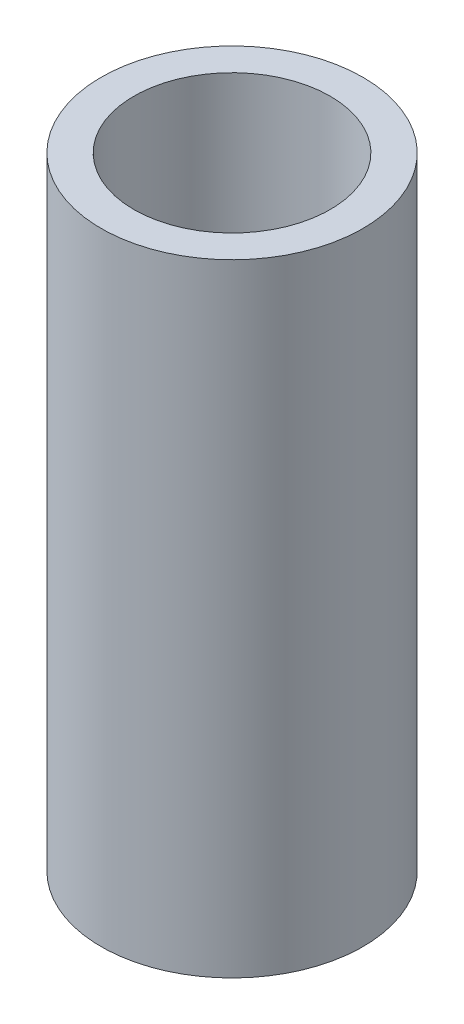
ISO-10303-21;
HEADER;
FILE_DESCRIPTION(('STEP AP214'),'2;1');
FILE_NAME('part.step','',(''),(''),'','','');
FILE_SCHEMA(('AUTOMOTIVE_DESIGN { 1 0 10303 214 1 1 1 1 }'));
ENDSEC;
DATA;
#1=APPLICATION_CONTEXT('core data for automotive mechanical design processes');
#2=APPLICATION_PROTOCOL_DEFINITION('international standard','automotive_design',2000,#1);
#3=PRODUCT_CONTEXT('',#1,'mechanical');
#4=PRODUCT('Part','Part','',(#3));
#5=PRODUCT_RELATED_PRODUCT_CATEGORY('part','',(#4));
#6=PRODUCT_DEFINITION_FORMATION('','',#4);
#7=PRODUCT_DEFINITION_CONTEXT('part definition',#1,'design');
#8=PRODUCT_DEFINITION('design','',#6,#7);
#9=PRODUCT_DEFINITION_SHAPE('','',#8);
#10=(LENGTH_UNIT() NAMED_UNIT(*) SI_UNIT(.MILLI.,.METRE.));
#11=(NAMED_UNIT(*) PLANE_ANGLE_UNIT() SI_UNIT($,.RADIAN.));
#12=(NAMED_UNIT(*) SI_UNIT($,.STERADIAN.) SOLID_ANGLE_UNIT());
#13=UNCERTAINTY_MEASURE_WITH_UNIT(LENGTH_MEASURE(1.E-05),#10,'distance_accuracy_value','');
#14=(GEOMETRIC_REPRESENTATION_CONTEXT(3) GLOBAL_UNCERTAINTY_ASSIGNED_CONTEXT((#13)) GLOBAL_UNIT_ASSIGNED_CONTEXT((#10,
#11,#12)) REPRESENTATION_CONTEXT('',''));
#15=CARTESIAN_POINT('',(0.,0.,0.));
#16=DIRECTION('',(0.,0.,1.));
#17=DIRECTION('',(1.,0.,0.));
#18=AXIS2_PLACEMENT_3D('',#15,#16,#17);
#19=CARTESIAN_POINT('',(0.,9.5,0.));
#20=DIRECTION('',(0.,1.,0.));
#21=DIRECTION('',(0.,0.,-1.));
#22=AXIS2_PLACEMENT_3D('',#19,#20,#21);
#23=PLANE('',#22);
#24=CARTESIAN_POINT('',(0.,9.5,0.));
#25=DIRECTION('',(0.,-1.,0.));
#26=DIRECTION('',(0.,0.,-1.));
#27=AXIS2_PLACEMENT_3D('',#24,#25,#26);
#28=CIRCLE('',#27,2.);
#29=CARTESIAN_POINT('',(0.,9.5,-2.));
#30=VERTEX_POINT('',#29);
#31=EDGE_CURVE('E10',#30,#30,#28,.T.);
#32=ORIENTED_EDGE('',*,*,#31,.F.);
#33=EDGE_LOOP('',(#32));
#34=FACE_BOUND('',#33,.T.);
#35=CARTESIAN_POINT('',(0.,9.5,0.));
#36=DIRECTION('',(0.,-1.,0.));
#37=DIRECTION('',(0.,0.,-1.));
#38=AXIS2_PLACEMENT_3D('',#35,#36,#37);
#39=CIRCLE('',#38,1.5);
#40=CARTESIAN_POINT('',(0.,9.5,-1.5));
#41=VERTEX_POINT('',#40);
#42=EDGE_CURVE('E41',#41,#41,#39,.T.);
#43=ORIENTED_EDGE('',*,*,#42,.T.);
#44=EDGE_LOOP('',(#43));
#45=FACE_BOUND('',#44,.T.);
#46=ADVANCED_FACE('F30',(#34,#45),#23,.T.);
#47=CARTESIAN_POINT('',(0.,0.,0.));
#48=DIRECTION('',(0.,1.,0.));
#49=DIRECTION('',(0.,0.,-1.));
#50=AXIS2_PLACEMENT_3D('',#47,#48,#49);
#51=PLANE('',#50);
#52=CARTESIAN_POINT('',(0.,0.,0.));
#53=DIRECTION('',(0.,-1.,0.));
#54=DIRECTION('',(0.,0.,-1.));
#55=AXIS2_PLACEMENT_3D('',#52,#53,#54);
#56=CIRCLE('',#55,2.);
#57=CARTESIAN_POINT('',(0.,0.,-2.));
#58=VERTEX_POINT('',#57);
#59=EDGE_CURVE('E34',#58,#58,#56,.T.);
#60=ORIENTED_EDGE('',*,*,#59,.T.);
#61=EDGE_LOOP('',(#60));
#62=FACE_BOUND('',#61,.T.);
#63=CARTESIAN_POINT('',(0.,0.,0.));
#64=DIRECTION('',(0.,-1.,0.));
#65=DIRECTION('',(0.,0.,-1.));
#66=AXIS2_PLACEMENT_3D('',#63,#64,#65);
#67=CIRCLE('',#66,1.5);
#68=CARTESIAN_POINT('',(0.,0.,-1.5));
#69=VERTEX_POINT('',#68);
#70=EDGE_CURVE('E43',#69,#69,#67,.T.);
#71=ORIENTED_EDGE('',*,*,#70,.F.);
#72=EDGE_LOOP('',(#71));
#73=FACE_BOUND('',#72,.T.);
#74=ADVANCED_FACE('F56',(#62,#73),#51,.F.);
#75=CARTESIAN_POINT('',(0.,9.5,0.));
#76=DIRECTION('',(0.,-1.,0.));
#77=DIRECTION('',(0.,0.,1.));
#78=AXIS2_PLACEMENT_3D('',#75,#76,#77);
#79=CYLINDRICAL_SURFACE('',#78,2.);
#80=ORIENTED_EDGE('',*,*,#31,.T.);
#81=EDGE_LOOP('',(#80));
#82=FACE_BOUND('',#81,.T.);
#83=ORIENTED_EDGE('',*,*,#59,.F.);
#84=EDGE_LOOP('',(#83));
#85=FACE_BOUND('',#84,.T.);
#86=ADVANCED_FACE('F32',(#82,#85),#79,.T.);
#87=CARTESIAN_POINT('',(0.,9.5,0.));
#88=DIRECTION('',(0.,-1.,0.));
#89=DIRECTION('',(0.,0.,1.));
#90=AXIS2_PLACEMENT_3D('',#87,#88,#89);
#91=CYLINDRICAL_SURFACE('',#90,1.5);
#92=ORIENTED_EDGE('',*,*,#42,.F.);
#93=EDGE_LOOP('',(#92));
#94=FACE_BOUND('',#93,.T.);
#95=ORIENTED_EDGE('',*,*,#70,.T.);
#96=EDGE_LOOP('',(#95));
#97=FACE_BOUND('',#96,.T.);
#98=ADVANCED_FACE('F50',(#94,#97),#91,.F.);
#99=CLOSED_SHELL('',(#46,#74,#86,#98));
#100=MANIFOLD_SOLID_BREP('B2',#99);
#101=ADVANCED_BREP_SHAPE_REPRESENTATION('',(#18,#100),#14);
#102=SHAPE_DEFINITION_REPRESENTATION(#9,#101);
ENDSEC;
END-ISO-10303-21;
